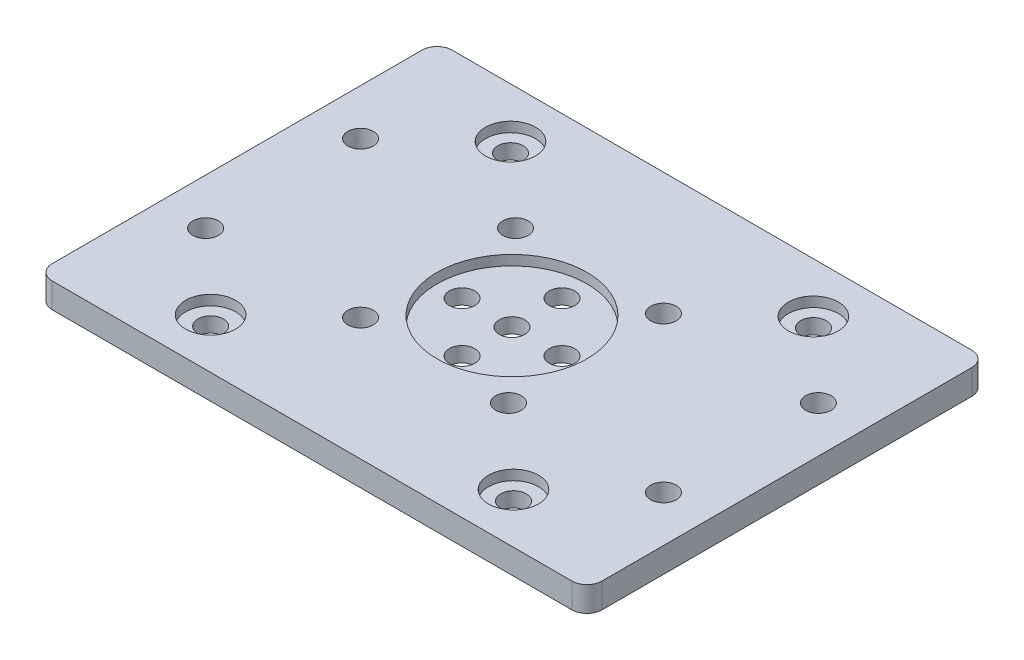
ISO-10303-21;
HEADER;
FILE_DESCRIPTION(('STEP AP214'),'2;1');
FILE_NAME('part.step','',(''),(''),'','','');
FILE_SCHEMA(('AUTOMOTIVE_DESIGN { 1 0 10303 214 1 1 1 1 }'));
ENDSEC;
DATA;
#1=APPLICATION_CONTEXT('core data for automotive mechanical design processes');
#2=APPLICATION_PROTOCOL_DEFINITION('international standard','automotive_design',2000,#1);
#3=PRODUCT_CONTEXT('',#1,'mechanical');
#4=PRODUCT('Part','Part','',(#3));
#5=PRODUCT_RELATED_PRODUCT_CATEGORY('part','',(#4));
#6=PRODUCT_DEFINITION_FORMATION('','',#4);
#7=PRODUCT_DEFINITION_CONTEXT('part definition',#1,'design');
#8=PRODUCT_DEFINITION('design','',#6,#7);
#9=PRODUCT_DEFINITION_SHAPE('','',#8);
#10=(LENGTH_UNIT() NAMED_UNIT(*) SI_UNIT(.MILLI.,.METRE.));
#11=(NAMED_UNIT(*) PLANE_ANGLE_UNIT() SI_UNIT($,.RADIAN.));
#12=(NAMED_UNIT(*) SI_UNIT($,.STERADIAN.) SOLID_ANGLE_UNIT());
#13=UNCERTAINTY_MEASURE_WITH_UNIT(LENGTH_MEASURE(1.E-05),#10,'distance_accuracy_value','');
#14=(GEOMETRIC_REPRESENTATION_CONTEXT(3) GLOBAL_UNCERTAINTY_ASSIGNED_CONTEXT((#13)) GLOBAL_UNIT_ASSIGNED_CONTEXT((#10,
#11,#12)) REPRESENTATION_CONTEXT('',''));
#15=CARTESIAN_POINT('',(0.,0.,0.));
#16=DIRECTION('',(0.,0.,1.));
#17=DIRECTION('',(1.,0.,0.));
#18=AXIS2_PLACEMENT_3D('',#15,#16,#17);
#19=CARTESIAN_POINT('',(0.,5.,0.));
#20=DIRECTION('',(0.,-1.,0.));
#21=DIRECTION('',(0.,0.,-1.));
#22=AXIS2_PLACEMENT_3D('',#19,#20,#21);
#23=CYLINDRICAL_SURFACE('',#22,2.55);
#24=CARTESIAN_POINT('',(0.,0.,0.));
#25=DIRECTION('',(0.,1.,0.));
#26=DIRECTION('',(0.,0.,1.));
#27=AXIS2_PLACEMENT_3D('',#24,#25,#26);
#28=CIRCLE('',#27,2.55);
#29=CARTESIAN_POINT('',(0.,0.,2.55));
#30=VERTEX_POINT('',#29);
#31=EDGE_CURVE('E137',#30,#30,#28,.T.);
#32=ORIENTED_EDGE('',*,*,#31,.F.);
#33=EDGE_LOOP('',(#32));
#34=FACE_BOUND('',#33,.T.);
#35=CARTESIAN_POINT('',(0.,3.,0.));
#36=DIRECTION('',(0.,1.,0.));
#37=DIRECTION('',(0.,0.,1.));
#38=AXIS2_PLACEMENT_3D('',#35,#36,#37);
#39=CIRCLE('',#38,2.55);
#40=CARTESIAN_POINT('',(0.,3.,2.55));
#41=VERTEX_POINT('',#40);
#42=EDGE_CURVE('E188',#41,#41,#39,.T.);
#43=ORIENTED_EDGE('',*,*,#42,.T.);
#44=EDGE_LOOP('',(#43));
#45=FACE_BOUND('',#44,.T.);
#46=ADVANCED_FACE('F33',(#34,#45),#23,.F.);
#47=CARTESIAN_POINT('',(0.,5.,-10.));
#48=DIRECTION('',(0.,-1.,0.));
#49=DIRECTION('',(0.,0.,-1.));
#50=AXIS2_PLACEMENT_3D('',#47,#48,#49);
#51=CYLINDRICAL_SURFACE('',#50,2.55);
#52=CARTESIAN_POINT('',(0.,0.,-10.));
#53=DIRECTION('',(0.,1.,0.));
#54=DIRECTION('',(0.,0.,1.));
#55=AXIS2_PLACEMENT_3D('',#52,#53,#54);
#56=CIRCLE('',#55,2.55);
#57=CARTESIAN_POINT('',(0.,0.,-7.45));
#58=VERTEX_POINT('',#57);
#59=EDGE_CURVE('E271',#58,#58,#56,.T.);
#60=ORIENTED_EDGE('',*,*,#59,.F.);
#61=EDGE_LOOP('',(#60));
#62=FACE_BOUND('',#61,.T.);
#63=CARTESIAN_POINT('',(0.,3.,-10.));
#64=DIRECTION('',(0.,1.,0.));
#65=DIRECTION('',(0.,0.,1.));
#66=AXIS2_PLACEMENT_3D('',#63,#64,#65);
#67=CIRCLE('',#66,2.55);
#68=CARTESIAN_POINT('',(0.,3.,-7.45));
#69=VERTEX_POINT('',#68);
#70=EDGE_CURVE('E353',#69,#69,#67,.T.);
#71=ORIENTED_EDGE('',*,*,#70,.T.);
#72=EDGE_LOOP('',(#71));
#73=FACE_BOUND('',#72,.T.);
#74=ADVANCED_FACE('F313',(#62,#73),#51,.F.);
#75=CARTESIAN_POINT('',(10.,5.,0.));
#76=DIRECTION('',(0.,-1.,0.));
#77=DIRECTION('',(0.,0.,-1.));
#78=AXIS2_PLACEMENT_3D('',#75,#76,#77);
#79=CYLINDRICAL_SURFACE('',#78,2.55);
#80=CARTESIAN_POINT('',(10.,0.,0.));
#81=DIRECTION('',(0.,1.,0.));
#82=DIRECTION('',(0.,0.,1.));
#83=AXIS2_PLACEMENT_3D('',#80,#81,#82);
#84=CIRCLE('',#83,2.55);
#85=CARTESIAN_POINT('',(10.,0.,2.55));
#86=VERTEX_POINT('',#85);
#87=EDGE_CURVE('E268',#86,#86,#84,.T.);
#88=ORIENTED_EDGE('',*,*,#87,.F.);
#89=EDGE_LOOP('',(#88));
#90=FACE_BOUND('',#89,.T.);
#91=CARTESIAN_POINT('',(10.,3.,0.));
#92=DIRECTION('',(0.,1.,0.));
#93=DIRECTION('',(0.,0.,1.));
#94=AXIS2_PLACEMENT_3D('',#91,#92,#93);
#95=CIRCLE('',#94,2.55);
#96=CARTESIAN_POINT('',(10.,3.,2.55));
#97=VERTEX_POINT('',#96);
#98=EDGE_CURVE('E355',#97,#97,#95,.T.);
#99=ORIENTED_EDGE('',*,*,#98,.T.);
#100=EDGE_LOOP('',(#99));
#101=FACE_BOUND('',#100,.T.);
#102=ADVANCED_FACE('F319',(#90,#101),#79,.F.);
#103=CARTESIAN_POINT('',(-9.99999999999999,5.,0.));
#104=DIRECTION('',(0.,-1.,0.));
#105=DIRECTION('',(0.,0.,-1.));
#106=AXIS2_PLACEMENT_3D('',#103,#104,#105);
#107=CYLINDRICAL_SURFACE('',#106,2.55);
#108=CARTESIAN_POINT('',(-9.99999999999999,0.,0.));
#109=DIRECTION('',(0.,1.,0.));
#110=DIRECTION('',(0.,0.,-1.));
#111=AXIS2_PLACEMENT_3D('',#108,#109,#110);
#112=CIRCLE('',#111,2.55);
#113=CARTESIAN_POINT('',(-9.99999999999999,0.,-2.55));
#114=VERTEX_POINT('',#113);
#115=EDGE_CURVE('E263',#114,#114,#112,.T.);
#116=ORIENTED_EDGE('',*,*,#115,.F.);
#117=EDGE_LOOP('',(#116));
#118=FACE_BOUND('',#117,.T.);
#119=CARTESIAN_POINT('',(-9.99999999999999,3.,0.));
#120=DIRECTION('',(0.,1.,0.));
#121=DIRECTION('',(0.,0.,1.));
#122=AXIS2_PLACEMENT_3D('',#119,#120,#121);
#123=CIRCLE('',#122,2.55);
#124=CARTESIAN_POINT('',(-9.99999999999999,3.,2.55));
#125=VERTEX_POINT('',#124);
#126=EDGE_CURVE('E358',#125,#125,#123,.T.);
#127=ORIENTED_EDGE('',*,*,#126,.T.);
#128=EDGE_LOOP('',(#127));
#129=FACE_BOUND('',#128,.T.);
#130=ADVANCED_FACE('F454',(#118,#129),#107,.F.);
#131=CARTESIAN_POINT('',(0.,5.,10.));
#132=DIRECTION('',(0.,-1.,0.));
#133=DIRECTION('',(0.,0.,-1.));
#134=AXIS2_PLACEMENT_3D('',#131,#132,#133);
#135=CYLINDRICAL_SURFACE('',#134,2.55);
#136=CARTESIAN_POINT('',(0.,0.,10.));
#137=DIRECTION('',(0.,1.,0.));
#138=DIRECTION('',(0.,0.,-1.));
#139=AXIS2_PLACEMENT_3D('',#136,#137,#138);
#140=CIRCLE('',#139,2.55);
#141=CARTESIAN_POINT('',(0.,0.,7.45));
#142=VERTEX_POINT('',#141);
#143=EDGE_CURVE('E242',#142,#142,#140,.T.);
#144=ORIENTED_EDGE('',*,*,#143,.F.);
#145=EDGE_LOOP('',(#144));
#146=FACE_BOUND('',#145,.T.);
#147=CARTESIAN_POINT('',(0.,3.,10.));
#148=DIRECTION('',(0.,1.,0.));
#149=DIRECTION('',(0.,0.,1.));
#150=AXIS2_PLACEMENT_3D('',#147,#148,#149);
#151=CIRCLE('',#150,2.55);
#152=CARTESIAN_POINT('',(0.,3.,12.55));
#153=VERTEX_POINT('',#152);
#154=EDGE_CURVE('E37',#153,#153,#151,.T.);
#155=ORIENTED_EDGE('',*,*,#154,.T.);
#156=EDGE_LOOP('',(#155));
#157=FACE_BOUND('',#156,.T.);
#158=ADVANCED_FACE('F373',(#146,#157),#135,.F.);
#159=CARTESIAN_POINT('',(30.3,5.,-30.));
#160=DIRECTION('',(0.,-1.,0.));
#161=DIRECTION('',(0.,0.,-1.));
#162=AXIS2_PLACEMENT_3D('',#159,#160,#161);
#163=CYLINDRICAL_SURFACE('',#162,2.54999999999999);
#164=CARTESIAN_POINT('',(30.3,0.,-30.));
#165=DIRECTION('',(0.,1.,0.));
#166=DIRECTION('',(0.,0.,1.));
#167=AXIS2_PLACEMENT_3D('',#164,#165,#166);
#168=CIRCLE('',#167,2.54999999999999);
#169=CARTESIAN_POINT('',(30.3,0.,-27.45));
#170=VERTEX_POINT('',#169);
#171=EDGE_CURVE('E247',#170,#170,#168,.T.);
#172=ORIENTED_EDGE('',*,*,#171,.F.);
#173=EDGE_LOOP('',(#172));
#174=FACE_BOUND('',#173,.T.);
#175=CARTESIAN_POINT('',(30.3,3.,-30.));
#176=DIRECTION('',(0.,1.,0.));
#177=DIRECTION('',(0.,0.,1.));
#178=AXIS2_PLACEMENT_3D('',#175,#176,#177);
#179=CIRCLE('',#178,2.54999999999999);
#180=CARTESIAN_POINT('',(30.3,3.,-27.45));
#181=VERTEX_POINT('',#180);
#182=EDGE_CURVE('E174',#181,#181,#179,.T.);
#183=ORIENTED_EDGE('',*,*,#182,.T.);
#184=EDGE_LOOP('',(#183));
#185=FACE_BOUND('',#184,.T.);
#186=ADVANCED_FACE('F443',(#174,#185),#163,.F.);
#187=CARTESIAN_POINT('',(30.3,5.,30.));
#188=DIRECTION('',(0.,-1.,0.));
#189=DIRECTION('',(0.,0.,-1.));
#190=AXIS2_PLACEMENT_3D('',#187,#188,#189);
#191=CYLINDRICAL_SURFACE('',#190,2.55);
#192=CARTESIAN_POINT('',(30.3,0.,30.));
#193=DIRECTION('',(0.,1.,0.));
#194=DIRECTION('',(0.,0.,-1.));
#195=AXIS2_PLACEMENT_3D('',#192,#193,#194);
#196=CIRCLE('',#195,2.55);
#197=CARTESIAN_POINT('',(30.3,0.,27.45));
#198=VERTEX_POINT('',#197);
#199=EDGE_CURVE('E227',#198,#198,#196,.T.);
#200=ORIENTED_EDGE('',*,*,#199,.F.);
#201=EDGE_LOOP('',(#200));
#202=FACE_BOUND('',#201,.T.);
#203=CARTESIAN_POINT('',(30.3,3.,30.));
#204=DIRECTION('',(0.,1.,0.));
#205=DIRECTION('',(0.,0.,1.));
#206=AXIS2_PLACEMENT_3D('',#203,#204,#205);
#207=CIRCLE('',#206,2.55);
#208=CARTESIAN_POINT('',(30.3,3.,32.55));
#209=VERTEX_POINT('',#208);
#210=EDGE_CURVE('E170',#209,#209,#207,.T.);
#211=ORIENTED_EDGE('',*,*,#210,.T.);
#212=EDGE_LOOP('',(#211));
#213=FACE_BOUND('',#212,.T.);
#214=ADVANCED_FACE('F440',(#202,#213),#191,.F.);
#215=CARTESIAN_POINT('',(-30.3,5.,-30.));
#216=DIRECTION('',(0.,-1.,0.));
#217=DIRECTION('',(0.,0.,-1.));
#218=AXIS2_PLACEMENT_3D('',#215,#216,#217);
#219=CYLINDRICAL_SURFACE('',#218,2.55);
#220=CARTESIAN_POINT('',(-30.3,0.,-30.));
#221=DIRECTION('',(0.,1.,0.));
#222=DIRECTION('',(0.,0.,1.));
#223=AXIS2_PLACEMENT_3D('',#220,#221,#222);
#224=CIRCLE('',#223,2.55);
#225=CARTESIAN_POINT('',(-30.3,0.,-27.45));
#226=VERTEX_POINT('',#225);
#227=EDGE_CURVE('E254',#226,#226,#224,.T.);
#228=ORIENTED_EDGE('',*,*,#227,.F.);
#229=EDGE_LOOP('',(#228));
#230=FACE_BOUND('',#229,.T.);
#231=CARTESIAN_POINT('',(-30.3,3.,-30.));
#232=DIRECTION('',(0.,1.,0.));
#233=DIRECTION('',(0.,0.,1.));
#234=AXIS2_PLACEMENT_3D('',#231,#232,#233);
#235=CIRCLE('',#234,2.55);
#236=CARTESIAN_POINT('',(-30.3,3.,-27.45));
#237=VERTEX_POINT('',#236);
#238=EDGE_CURVE('E165',#237,#237,#235,.T.);
#239=ORIENTED_EDGE('',*,*,#238,.T.);
#240=EDGE_LOOP('',(#239));
#241=FACE_BOUND('',#240,.T.);
#242=ADVANCED_FACE('F422',(#230,#241),#219,.F.);
#243=CARTESIAN_POINT('',(-30.3,5.,30.));
#244=DIRECTION('',(0.,-1.,0.));
#245=DIRECTION('',(0.,0.,-1.));
#246=AXIS2_PLACEMENT_3D('',#243,#244,#245);
#247=CYLINDRICAL_SURFACE('',#246,2.55);
#248=CARTESIAN_POINT('',(-30.3,0.,30.));
#249=DIRECTION('',(0.,1.,0.));
#250=DIRECTION('',(0.,0.,-1.));
#251=AXIS2_PLACEMENT_3D('',#248,#249,#250);
#252=CIRCLE('',#251,2.55);
#253=CARTESIAN_POINT('',(-30.3,0.,27.45));
#254=VERTEX_POINT('',#253);
#255=EDGE_CURVE('E163',#254,#254,#252,.T.);
#256=ORIENTED_EDGE('',*,*,#255,.F.);
#257=EDGE_LOOP('',(#256));
#258=FACE_BOUND('',#257,.T.);
#259=CARTESIAN_POINT('',(-30.3,3.,30.));
#260=DIRECTION('',(0.,1.,0.));
#261=DIRECTION('',(0.,0.,1.));
#262=AXIS2_PLACEMENT_3D('',#259,#260,#261);
#263=CIRCLE('',#262,2.55);
#264=CARTESIAN_POINT('',(-30.3,3.,32.55));
#265=VERTEX_POINT('',#264);
#266=EDGE_CURVE('E160',#265,#265,#263,.T.);
#267=ORIENTED_EDGE('',*,*,#266,.T.);
#268=EDGE_LOOP('',(#267));
#269=FACE_BOUND('',#268,.T.);
#270=ADVANCED_FACE('F327',(#258,#269),#247,.F.);
#271=CARTESIAN_POINT('',(-52.,5.,37.));
#272=DIRECTION('',(0.,-1.,0.));
#273=DIRECTION('',(0.,0.,-1.));
#274=AXIS2_PLACEMENT_3D('',#271,#272,#273);
#275=PLANE('',#274);
#276=CARTESIAN_POINT('',(0.,5.,0.));
#277=DIRECTION('',(0.,1.,0.));
#278=DIRECTION('',(0.,0.,1.));
#279=AXIS2_PLACEMENT_3D('',#276,#277,#278);
#280=CIRCLE('',#279,15.);
#281=CARTESIAN_POINT('',(0.,5.,15.));
#282=VERTEX_POINT('',#281);
#283=EDGE_CURVE('E363',#282,#282,#280,.T.);
#284=ORIENTED_EDGE('',*,*,#283,.F.);
#285=EDGE_LOOP('',(#284));
#286=FACE_BOUND('',#285,.T.);
#287=CARTESIAN_POINT('',(30.3,5.,-30.));
#288=DIRECTION('',(0.,1.,0.));
#289=DIRECTION('',(0.,0.,1.));
#290=AXIS2_PLACEMENT_3D('',#287,#288,#289);
#291=CIRCLE('',#290,4.99999999999999);
#292=CARTESIAN_POINT('',(30.3,5.,-25.));
#293=VERTEX_POINT('',#292);
#294=EDGE_CURVE('E183',#293,#293,#291,.T.);
#295=ORIENTED_EDGE('',*,*,#294,.F.);
#296=EDGE_LOOP('',(#295));
#297=FACE_BOUND('',#296,.T.);
#298=CARTESIAN_POINT('',(30.3,5.,30.));
#299=DIRECTION('',(0.,1.,0.));
#300=DIRECTION('',(0.,0.,1.));
#301=AXIS2_PLACEMENT_3D('',#298,#299,#300);
#302=CIRCLE('',#301,5.);
#303=CARTESIAN_POINT('',(30.3,5.,35.));
#304=VERTEX_POINT('',#303);
#305=EDGE_CURVE('E176',#304,#304,#302,.T.);
#306=ORIENTED_EDGE('',*,*,#305,.F.);
#307=EDGE_LOOP('',(#306));
#308=FACE_BOUND('',#307,.T.);
#309=CARTESIAN_POINT('',(-30.3,5.,-30.));
#310=DIRECTION('',(0.,1.,0.));
#311=DIRECTION('',(0.,0.,1.));
#312=AXIS2_PLACEMENT_3D('',#309,#310,#311);
#313=CIRCLE('',#312,5.);
#314=CARTESIAN_POINT('',(-30.3,5.,-25.));
#315=VERTEX_POINT('',#314);
#316=EDGE_CURVE('E172',#315,#315,#313,.T.);
#317=ORIENTED_EDGE('',*,*,#316,.F.);
#318=EDGE_LOOP('',(#317));
#319=FACE_BOUND('',#318,.T.);
#320=CARTESIAN_POINT('',(-30.3,5.,30.));
#321=DIRECTION('',(0.,1.,0.));
#322=DIRECTION('',(0.,0.,1.));
#323=AXIS2_PLACEMENT_3D('',#320,#321,#322);
#324=CIRCLE('',#323,5.);
#325=CARTESIAN_POINT('',(-30.3,5.,35.));
#326=VERTEX_POINT('',#325);
#327=EDGE_CURVE('E168',#326,#326,#324,.T.);
#328=ORIENTED_EDGE('',*,*,#327,.F.);
#329=EDGE_LOOP('',(#328));
#330=FACE_BOUND('',#329,.T.);
#331=CARTESIAN_POINT('',(-45.8,5.,15.5));
#332=DIRECTION('',(0.,1.,0.));
#333=DIRECTION('',(0.,0.,-1.));
#334=AXIS2_PLACEMENT_3D('',#331,#332,#333);
#335=CIRCLE('',#334,2.55);
#336=CARTESIAN_POINT('',(-45.8,5.,12.95));
#337=VERTEX_POINT('',#336);
#338=EDGE_CURVE('E206',#337,#337,#335,.T.);
#339=ORIENTED_EDGE('',*,*,#338,.F.);
#340=EDGE_LOOP('',(#339));
#341=FACE_BOUND('',#340,.T.);
#342=CARTESIAN_POINT('',(14.8,5.,15.5));
#343=DIRECTION('',(0.,1.,0.));
#344=DIRECTION('',(0.,0.,1.));
#345=AXIS2_PLACEMENT_3D('',#342,#343,#344);
#346=CIRCLE('',#345,2.55);
#347=CARTESIAN_POINT('',(14.8,5.,18.05));
#348=VERTEX_POINT('',#347);
#349=EDGE_CURVE('E218',#348,#348,#346,.T.);
#350=ORIENTED_EDGE('',*,*,#349,.F.);
#351=EDGE_LOOP('',(#350));
#352=FACE_BOUND('',#351,.T.);
#353=CARTESIAN_POINT('',(14.8,5.,-15.5));
#354=DIRECTION('',(0.,1.,0.));
#355=DIRECTION('',(0.,0.,-1.));
#356=AXIS2_PLACEMENT_3D('',#353,#354,#355);
#357=CIRCLE('',#356,2.55);
#358=CARTESIAN_POINT('',(14.8,5.,-18.05));
#359=VERTEX_POINT('',#358);
#360=EDGE_CURVE('E239',#359,#359,#357,.T.);
#361=ORIENTED_EDGE('',*,*,#360,.F.);
#362=EDGE_LOOP('',(#361));
#363=FACE_BOUND('',#362,.T.);
#364=CARTESIAN_POINT('',(-52.,5.,37.));
#365=DIRECTION('',(0.,1.,0.));
#366=DIRECTION('',(0.,0.,-1.));
#367=AXIS2_PLACEMENT_3D('',#364,#365,#366);
#368=CIRCLE('',#367,3.00000000000001);
#369=CARTESIAN_POINT('',(-55.,5.,37.));
#370=VERTEX_POINT('',#369);
#371=CARTESIAN_POINT('',(-52.,5.,40.));
#372=VERTEX_POINT('',#371);
#373=EDGE_CURVE('E148',#370,#372,#368,.T.);
#374=ORIENTED_EDGE('',*,*,#373,.T.);
#375=DIRECTION('',(1.,0.,0.));
#376=VECTOR('',#375,1.);
#377=CARTESIAN_POINT('',(52.,5.,40.));
#378=LINE('',#377,#376);
#379=CARTESIAN_POINT('',(52.,5.,40.));
#380=VERTEX_POINT('',#379);
#381=EDGE_CURVE('E95',#372,#380,#378,.T.);
#382=ORIENTED_EDGE('',*,*,#381,.T.);
#383=CARTESIAN_POINT('',(52.,5.,37.));
#384=DIRECTION('',(0.,1.,0.));
#385=DIRECTION('',(0.,0.,1.));
#386=AXIS2_PLACEMENT_3D('',#383,#384,#385);
#387=CIRCLE('',#386,3.00000000000002);
#388=CARTESIAN_POINT('',(55.,5.,37.));
#389=VERTEX_POINT('',#388);
#390=EDGE_CURVE('E278',#380,#389,#387,.T.);
#391=ORIENTED_EDGE('',*,*,#390,.T.);
#392=DIRECTION('',(0.,0.,-1.));
#393=VECTOR('',#392,1.);
#394=CARTESIAN_POINT('',(55.,5.,37.));
#395=LINE('',#394,#393);
#396=CARTESIAN_POINT('',(55.,5.,-37.));
#397=VERTEX_POINT('',#396);
#398=EDGE_CURVE('E280',#389,#397,#395,.T.);
#399=ORIENTED_EDGE('',*,*,#398,.T.);
#400=CARTESIAN_POINT('',(52.,5.,-37.));
#401=DIRECTION('',(0.,1.,0.));
#402=DIRECTION('',(0.,0.,1.));
#403=AXIS2_PLACEMENT_3D('',#400,#401,#402);
#404=CIRCLE('',#403,3.00000000000002);
#405=CARTESIAN_POINT('',(52.,5.,-40.));
#406=VERTEX_POINT('',#405);
#407=EDGE_CURVE('E115',#397,#406,#404,.T.);
#408=ORIENTED_EDGE('',*,*,#407,.T.);
#409=DIRECTION('',(-1.,0.,0.));
#410=VECTOR('',#409,1.);
#411=CARTESIAN_POINT('',(52.,5.,-40.));
#412=LINE('',#411,#410);
#413=CARTESIAN_POINT('',(-52.,5.,-40.));
#414=VERTEX_POINT('',#413);
#415=EDGE_CURVE('E108',#406,#414,#412,.T.);
#416=ORIENTED_EDGE('',*,*,#415,.T.);
#417=CARTESIAN_POINT('',(-52.,5.,-37.));
#418=DIRECTION('',(0.,1.,0.));
#419=DIRECTION('',(0.,0.,1.));
#420=AXIS2_PLACEMENT_3D('',#417,#418,#419);
#421=CIRCLE('',#420,3.00000000000002);
#422=CARTESIAN_POINT('',(-55.,5.,-37.));
#423=VERTEX_POINT('',#422);
#424=EDGE_CURVE('E113',#414,#423,#421,.T.);
#425=ORIENTED_EDGE('',*,*,#424,.T.);
#426=DIRECTION('',(0.,0.,1.));
#427=VECTOR('',#426,1.);
#428=CARTESIAN_POINT('',(-55.,5.,37.));
#429=LINE('',#428,#427);
#430=EDGE_CURVE('E52',#423,#370,#429,.T.);
#431=ORIENTED_EDGE('',*,*,#430,.T.);
#432=EDGE_LOOP('',(#374,#382,#391,#399,#408,#416,#425,#431));
#433=FACE_BOUND('',#432,.T.);
#434=CARTESIAN_POINT('',(-45.8,5.,-15.5));
#435=DIRECTION('',(0.,1.,0.));
#436=DIRECTION('',(0.,0.,1.));
#437=AXIS2_PLACEMENT_3D('',#434,#435,#436);
#438=CIRCLE('',#437,2.55);
#439=CARTESIAN_POINT('',(-45.8,5.,-12.95));
#440=VERTEX_POINT('',#439);
#441=EDGE_CURVE('E260',#440,#440,#438,.T.);
#442=ORIENTED_EDGE('',*,*,#441,.F.);
#443=EDGE_LOOP('',(#442));
#444=FACE_BOUND('',#443,.T.);
#445=CARTESIAN_POINT('',(-14.8,5.,-15.5));
#446=DIRECTION('',(0.,1.,0.));
#447=DIRECTION('',(0.,0.,1.));
#448=AXIS2_PLACEMENT_3D('',#445,#446,#447);
#449=CIRCLE('',#448,2.55);
#450=CARTESIAN_POINT('',(-14.8,5.,-12.95));
#451=VERTEX_POINT('',#450);
#452=EDGE_CURVE('E251',#451,#451,#449,.T.);
#453=ORIENTED_EDGE('',*,*,#452,.F.);
#454=EDGE_LOOP('',(#453));
#455=FACE_BOUND('',#454,.T.);
#456=CARTESIAN_POINT('',(45.8,5.,-15.5));
#457=DIRECTION('',(0.,1.,0.));
#458=DIRECTION('',(0.,0.,-1.));
#459=AXIS2_PLACEMENT_3D('',#456,#457,#458);
#460=CIRCLE('',#459,2.55000000000001);
#461=CARTESIAN_POINT('',(45.8,5.,-18.05));
#462=VERTEX_POINT('',#461);
#463=EDGE_CURVE('E233',#462,#462,#460,.T.);
#464=ORIENTED_EDGE('',*,*,#463,.F.);
#465=EDGE_LOOP('',(#464));
#466=FACE_BOUND('',#465,.T.);
#467=CARTESIAN_POINT('',(45.8,5.,15.5));
#468=DIRECTION('',(0.,1.,0.));
#469=DIRECTION('',(0.,0.,1.));
#470=AXIS2_PLACEMENT_3D('',#467,#468,#469);
#471=CIRCLE('',#470,2.55000000000001);
#472=CARTESIAN_POINT('',(45.8,5.,18.05));
#473=VERTEX_POINT('',#472);
#474=EDGE_CURVE('E224',#473,#473,#471,.T.);
#475=ORIENTED_EDGE('',*,*,#474,.F.);
#476=EDGE_LOOP('',(#475));
#477=FACE_BOUND('',#476,.T.);
#478=CARTESIAN_POINT('',(-14.8,5.,15.5));
#479=DIRECTION('',(0.,1.,0.));
#480=DIRECTION('',(0.,0.,-1.));
#481=AXIS2_PLACEMENT_3D('',#478,#479,#480);
#482=CIRCLE('',#481,2.55);
#483=CARTESIAN_POINT('',(-14.8,5.,12.95));
#484=VERTEX_POINT('',#483);
#485=EDGE_CURVE('E212',#484,#484,#482,.T.);
#486=ORIENTED_EDGE('',*,*,#485,.F.);
#487=EDGE_LOOP('',(#486));
#488=FACE_BOUND('',#487,.T.);
#489=ADVANCED_FACE('F110',(#286,#297,#308,#319,#330,#341,#352,#363,#433,#444,#455,#466,#477,
#488),#275,.F.);
#490=CARTESIAN_POINT('',(-52.,0.,37.));
#491=DIRECTION('',(0.,-1.,0.));
#492=DIRECTION('',(0.,0.,-1.));
#493=AXIS2_PLACEMENT_3D('',#490,#491,#492);
#494=PLANE('',#493);
#495=CARTESIAN_POINT('',(-45.8,0.,15.5));
#496=DIRECTION('',(0.,1.,0.));
#497=DIRECTION('',(0.,0.,-1.));
#498=AXIS2_PLACEMENT_3D('',#495,#496,#497);
#499=CIRCLE('',#498,2.55);
#500=CARTESIAN_POINT('',(-45.8,0.,12.95));
#501=VERTEX_POINT('',#500);
#502=EDGE_CURVE('E205',#501,#501,#499,.T.);
#503=ORIENTED_EDGE('',*,*,#502,.T.);
#504=EDGE_LOOP('',(#503));
#505=FACE_BOUND('',#504,.T.);
#506=CARTESIAN_POINT('',(14.8,0.,15.5));
#507=DIRECTION('',(0.,1.,0.));
#508=DIRECTION('',(0.,0.,1.));
#509=AXIS2_PLACEMENT_3D('',#506,#507,#508);
#510=CIRCLE('',#509,2.55);
#511=CARTESIAN_POINT('',(14.8,0.,18.05));
#512=VERTEX_POINT('',#511);
#513=EDGE_CURVE('E215',#512,#512,#510,.T.);
#514=ORIENTED_EDGE('',*,*,#513,.T.);
#515=EDGE_LOOP('',(#514));
#516=FACE_BOUND('',#515,.T.);
#517=ORIENTED_EDGE('',*,*,#199,.T.);
#518=EDGE_LOOP('',(#517));
#519=FACE_BOUND('',#518,.T.);
#520=CARTESIAN_POINT('',(14.8,0.,-15.5));
#521=DIRECTION('',(0.,1.,0.));
#522=DIRECTION('',(0.,0.,-1.));
#523=AXIS2_PLACEMENT_3D('',#520,#521,#522);
#524=CIRCLE('',#523,2.55);
#525=CARTESIAN_POINT('',(14.8,0.,-18.05));
#526=VERTEX_POINT('',#525);
#527=EDGE_CURVE('E236',#526,#526,#524,.T.);
#528=ORIENTED_EDGE('',*,*,#527,.T.);
#529=EDGE_LOOP('',(#528));
#530=FACE_BOUND('',#529,.T.);
#531=ORIENTED_EDGE('',*,*,#171,.T.);
#532=EDGE_LOOP('',(#531));
#533=FACE_BOUND('',#532,.T.);
#534=ORIENTED_EDGE('',*,*,#227,.T.);
#535=EDGE_LOOP('',(#534));
#536=FACE_BOUND('',#535,.T.);
#537=ORIENTED_EDGE('',*,*,#115,.T.);
#538=EDGE_LOOP('',(#537));
#539=FACE_BOUND('',#538,.T.);
#540=ORIENTED_EDGE('',*,*,#59,.T.);
#541=EDGE_LOOP('',(#540));
#542=FACE_BOUND('',#541,.T.);
#543=CARTESIAN_POINT('',(-52.,0.,37.));
#544=DIRECTION('',(0.,1.,0.));
#545=DIRECTION('',(0.,0.,-1.));
#546=AXIS2_PLACEMENT_3D('',#543,#544,#545);
#547=CIRCLE('',#546,3.00000000000001);
#548=CARTESIAN_POINT('',(-55.,0.,37.));
#549=VERTEX_POINT('',#548);
#550=CARTESIAN_POINT('',(-52.,0.,40.));
#551=VERTEX_POINT('',#550);
#552=EDGE_CURVE('E133',#549,#551,#547,.T.);
#553=ORIENTED_EDGE('',*,*,#552,.F.);
#554=DIRECTION('',(0.,0.,1.));
#555=VECTOR('',#554,1.);
#556=CARTESIAN_POINT('',(-55.,0.,37.));
#557=LINE('',#556,#555);
#558=CARTESIAN_POINT('',(-55.,0.,-37.));
#559=VERTEX_POINT('',#558);
#560=EDGE_CURVE('E87',#559,#549,#557,.T.);
#561=ORIENTED_EDGE('',*,*,#560,.F.);
#562=CARTESIAN_POINT('',(-52.,0.,-37.));
#563=DIRECTION('',(0.,1.,0.));
#564=DIRECTION('',(0.,0.,1.));
#565=AXIS2_PLACEMENT_3D('',#562,#563,#564);
#566=CIRCLE('',#565,3.00000000000002);
#567=CARTESIAN_POINT('',(-52.,0.,-40.));
#568=VERTEX_POINT('',#567);
#569=EDGE_CURVE('E81',#568,#559,#566,.T.);
#570=ORIENTED_EDGE('',*,*,#569,.F.);
#571=DIRECTION('',(-1.,0.,0.));
#572=VECTOR('',#571,1.);
#573=CARTESIAN_POINT('',(52.,0.,-40.));
#574=LINE('',#573,#572);
#575=CARTESIAN_POINT('',(52.,0.,-40.));
#576=VERTEX_POINT('',#575);
#577=EDGE_CURVE('E123',#576,#568,#574,.T.);
#578=ORIENTED_EDGE('',*,*,#577,.F.);
#579=CARTESIAN_POINT('',(52.,0.,-37.));
#580=DIRECTION('',(0.,1.,0.));
#581=DIRECTION('',(0.,0.,1.));
#582=AXIS2_PLACEMENT_3D('',#579,#580,#581);
#583=CIRCLE('',#582,3.00000000000002);
#584=CARTESIAN_POINT('',(55.,0.,-37.));
#585=VERTEX_POINT('',#584);
#586=EDGE_CURVE('E143',#585,#576,#583,.T.);
#587=ORIENTED_EDGE('',*,*,#586,.F.);
#588=DIRECTION('',(0.,0.,-1.));
#589=VECTOR('',#588,1.);
#590=CARTESIAN_POINT('',(55.,0.,37.));
#591=LINE('',#590,#589);
#592=CARTESIAN_POINT('',(55.,0.,37.));
#593=VERTEX_POINT('',#592);
#594=EDGE_CURVE('E141',#593,#585,#591,.T.);
#595=ORIENTED_EDGE('',*,*,#594,.F.);
#596=CARTESIAN_POINT('',(52.,0.,37.));
#597=DIRECTION('',(0.,1.,0.));
#598=DIRECTION('',(0.,0.,1.));
#599=AXIS2_PLACEMENT_3D('',#596,#597,#598);
#600=CIRCLE('',#599,3.00000000000002);
#601=CARTESIAN_POINT('',(52.,0.,40.));
#602=VERTEX_POINT('',#601);
#603=EDGE_CURVE('E139',#602,#593,#600,.T.);
#604=ORIENTED_EDGE('',*,*,#603,.F.);
#605=DIRECTION('',(1.,0.,0.));
#606=VECTOR('',#605,1.);
#607=CARTESIAN_POINT('',(52.,0.,40.));
#608=LINE('',#607,#606);
#609=EDGE_CURVE('E136',#551,#602,#608,.T.);
#610=ORIENTED_EDGE('',*,*,#609,.F.);
#611=EDGE_LOOP('',(#553,#561,#570,#578,#587,#595,#604,#610));
#612=FACE_BOUND('',#611,.T.);
#613=ORIENTED_EDGE('',*,*,#31,.T.);
#614=EDGE_LOOP('',(#613));
#615=FACE_BOUND('',#614,.T.);
#616=ORIENTED_EDGE('',*,*,#87,.T.);
#617=EDGE_LOOP('',(#616));
#618=FACE_BOUND('',#617,.T.);
#619=CARTESIAN_POINT('',(-45.8,0.,-15.5));
#620=DIRECTION('',(0.,1.,0.));
#621=DIRECTION('',(0.,0.,1.));
#622=AXIS2_PLACEMENT_3D('',#619,#620,#621);
#623=CIRCLE('',#622,2.55);
#624=CARTESIAN_POINT('',(-45.8,0.,-12.95));
#625=VERTEX_POINT('',#624);
#626=EDGE_CURVE('E259',#625,#625,#623,.T.);
#627=ORIENTED_EDGE('',*,*,#626,.T.);
#628=EDGE_LOOP('',(#627));
#629=FACE_BOUND('',#628,.T.);
#630=CARTESIAN_POINT('',(-14.8,0.,-15.5));
#631=DIRECTION('',(0.,1.,0.));
#632=DIRECTION('',(0.,0.,1.));
#633=AXIS2_PLACEMENT_3D('',#630,#631,#632);
#634=CIRCLE('',#633,2.55);
#635=CARTESIAN_POINT('',(-14.8,0.,-12.95));
#636=VERTEX_POINT('',#635);
#637=EDGE_CURVE('E250',#636,#636,#634,.T.);
#638=ORIENTED_EDGE('',*,*,#637,.T.);
#639=EDGE_LOOP('',(#638));
#640=FACE_BOUND('',#639,.T.);
#641=ORIENTED_EDGE('',*,*,#143,.T.);
#642=EDGE_LOOP('',(#641));
#643=FACE_BOUND('',#642,.T.);
#644=CARTESIAN_POINT('',(45.8,0.,-15.5));
#645=DIRECTION('',(0.,1.,0.));
#646=DIRECTION('',(0.,0.,-1.));
#647=AXIS2_PLACEMENT_3D('',#644,#645,#646);
#648=CIRCLE('',#647,2.55000000000001);
#649=CARTESIAN_POINT('',(45.8,0.,-18.05));
#650=VERTEX_POINT('',#649);
#651=EDGE_CURVE('E232',#650,#650,#648,.T.);
#652=ORIENTED_EDGE('',*,*,#651,.T.);
#653=EDGE_LOOP('',(#652));
#654=FACE_BOUND('',#653,.T.);
#655=CARTESIAN_POINT('',(45.8,0.,15.5));
#656=DIRECTION('',(0.,1.,0.));
#657=DIRECTION('',(0.,0.,1.));
#658=AXIS2_PLACEMENT_3D('',#655,#656,#657);
#659=CIRCLE('',#658,2.55000000000001);
#660=CARTESIAN_POINT('',(45.8,0.,18.05));
#661=VERTEX_POINT('',#660);
#662=EDGE_CURVE('E221',#661,#661,#659,.T.);
#663=ORIENTED_EDGE('',*,*,#662,.T.);
#664=EDGE_LOOP('',(#663));
#665=FACE_BOUND('',#664,.T.);
#666=CARTESIAN_POINT('',(-14.8,0.,15.5));
#667=DIRECTION('',(0.,1.,0.));
#668=DIRECTION('',(0.,0.,-1.));
#669=AXIS2_PLACEMENT_3D('',#666,#667,#668);
#670=CIRCLE('',#669,2.55);
#671=CARTESIAN_POINT('',(-14.8,0.,12.95));
#672=VERTEX_POINT('',#671);
#673=EDGE_CURVE('E209',#672,#672,#670,.T.);
#674=ORIENTED_EDGE('',*,*,#673,.T.);
#675=EDGE_LOOP('',(#674));
#676=FACE_BOUND('',#675,.T.);
#677=ORIENTED_EDGE('',*,*,#255,.T.);
#678=EDGE_LOOP('',(#677));
#679=FACE_BOUND('',#678,.T.);
#680=ADVANCED_FACE('F293',(#505,#516,#519,#530,#533,#536,#539,#542,#612,#615,#618,#629,#640,
#643,#654,#665,#676,#679),#494,.T.);
#681=CARTESIAN_POINT('',(-52.,5.,37.));
#682=DIRECTION('',(0.,-1.,0.));
#683=DIRECTION('',(0.,0.,-1.));
#684=AXIS2_PLACEMENT_3D('',#681,#682,#683);
#685=CYLINDRICAL_SURFACE('',#684,3.00000000000001);
#686=ORIENTED_EDGE('',*,*,#552,.T.);
#687=DIRECTION('',(0.,-1.,0.));
#688=VECTOR('',#687,1.);
#689=CARTESIAN_POINT('',(-52.,5.,40.));
#690=LINE('',#689,#688);
#691=EDGE_CURVE('E11',#372,#551,#690,.T.);
#692=ORIENTED_EDGE('',*,*,#691,.F.);
#693=ORIENTED_EDGE('',*,*,#373,.F.);
#694=DIRECTION('',(0.,-1.,0.));
#695=VECTOR('',#694,1.);
#696=CARTESIAN_POINT('',(-55.,5.,37.));
#697=LINE('',#696,#695);
#698=EDGE_CURVE('E129',#370,#549,#697,.T.);
#699=ORIENTED_EDGE('',*,*,#698,.T.);
#700=EDGE_LOOP('',(#686,#692,#693,#699));
#701=FACE_BOUND('',#700,.T.);
#702=ADVANCED_FACE('F35',(#701),#685,.T.);
#703=CARTESIAN_POINT('',(52.,5.,40.));
#704=DIRECTION('',(0.,0.,-1.));
#705=DIRECTION('',(-1.,0.,0.));
#706=AXIS2_PLACEMENT_3D('',#703,#704,#705);
#707=PLANE('',#706);
#708=ORIENTED_EDGE('',*,*,#609,.T.);
#709=DIRECTION('',(0.,-1.,0.));
#710=VECTOR('',#709,1.);
#711=CARTESIAN_POINT('',(52.,5.,40.));
#712=LINE('',#711,#710);
#713=EDGE_CURVE('E43',#380,#602,#712,.T.);
#714=ORIENTED_EDGE('',*,*,#713,.F.);
#715=ORIENTED_EDGE('',*,*,#381,.F.);
#716=ORIENTED_EDGE('',*,*,#691,.T.);
#717=EDGE_LOOP('',(#708,#714,#715,#716));
#718=FACE_BOUND('',#717,.T.);
#719=ADVANCED_FACE('F334',(#718),#707,.F.);
#720=CARTESIAN_POINT('',(52.,5.,37.));
#721=DIRECTION('',(0.,-1.,0.));
#722=DIRECTION('',(0.,0.,-1.));
#723=AXIS2_PLACEMENT_3D('',#720,#721,#722);
#724=CYLINDRICAL_SURFACE('',#723,3.00000000000002);
#725=ORIENTED_EDGE('',*,*,#603,.T.);
#726=DIRECTION('',(0.,-1.,0.));
#727=VECTOR('',#726,1.);
#728=CARTESIAN_POINT('',(55.,5.,37.));
#729=LINE('',#728,#727);
#730=EDGE_CURVE('E155',#389,#593,#729,.T.);
#731=ORIENTED_EDGE('',*,*,#730,.F.);
#732=ORIENTED_EDGE('',*,*,#390,.F.);
#733=ORIENTED_EDGE('',*,*,#713,.T.);
#734=EDGE_LOOP('',(#725,#731,#732,#733));
#735=FACE_BOUND('',#734,.T.);
#736=ADVANCED_FACE('F673',(#735),#724,.T.);
#737=CARTESIAN_POINT('',(55.,5.,37.));
#738=DIRECTION('',(-1.,0.,0.));
#739=DIRECTION('',(0.,0.,1.));
#740=AXIS2_PLACEMENT_3D('',#737,#738,#739);
#741=PLANE('',#740);
#742=ORIENTED_EDGE('',*,*,#594,.T.);
#743=DIRECTION('',(0.,-1.,0.));
#744=VECTOR('',#743,1.);
#745=CARTESIAN_POINT('',(55.,5.,-37.));
#746=LINE('',#745,#744);
#747=EDGE_CURVE('E152',#397,#585,#746,.T.);
#748=ORIENTED_EDGE('',*,*,#747,.F.);
#749=ORIENTED_EDGE('',*,*,#398,.F.);
#750=ORIENTED_EDGE('',*,*,#730,.T.);
#751=EDGE_LOOP('',(#742,#748,#749,#750));
#752=FACE_BOUND('',#751,.T.);
#753=ADVANCED_FACE('F286',(#752),#741,.F.);
#754=CARTESIAN_POINT('',(52.,5.,-37.));
#755=DIRECTION('',(0.,-1.,0.));
#756=DIRECTION('',(0.,0.,-1.));
#757=AXIS2_PLACEMENT_3D('',#754,#755,#756);
#758=CYLINDRICAL_SURFACE('',#757,3.00000000000002);
#759=ORIENTED_EDGE('',*,*,#586,.T.);
#760=DIRECTION('',(0.,-1.,0.));
#761=VECTOR('',#760,1.);
#762=CARTESIAN_POINT('',(52.,5.,-40.));
#763=LINE('',#762,#761);
#764=EDGE_CURVE('E124',#406,#576,#763,.T.);
#765=ORIENTED_EDGE('',*,*,#764,.F.);
#766=ORIENTED_EDGE('',*,*,#407,.F.);
#767=ORIENTED_EDGE('',*,*,#747,.T.);
#768=EDGE_LOOP('',(#759,#765,#766,#767));
#769=FACE_BOUND('',#768,.T.);
#770=ADVANCED_FACE('F290',(#769),#758,.T.);
#771=CARTESIAN_POINT('',(52.,5.,-40.));
#772=DIRECTION('',(0.,0.,1.));
#773=DIRECTION('',(1.,0.,0.));
#774=AXIS2_PLACEMENT_3D('',#771,#772,#773);
#775=PLANE('',#774);
#776=ORIENTED_EDGE('',*,*,#577,.T.);
#777=DIRECTION('',(0.,-1.,0.));
#778=VECTOR('',#777,1.);
#779=CARTESIAN_POINT('',(-52.,5.,-40.));
#780=LINE('',#779,#778);
#781=EDGE_CURVE('E120',#414,#568,#780,.T.);
#782=ORIENTED_EDGE('',*,*,#781,.F.);
#783=ORIENTED_EDGE('',*,*,#415,.F.);
#784=ORIENTED_EDGE('',*,*,#764,.T.);
#785=EDGE_LOOP('',(#776,#782,#783,#784));
#786=FACE_BOUND('',#785,.T.);
#787=ADVANCED_FACE('F121',(#786),#775,.F.);
#788=CARTESIAN_POINT('',(-52.,5.,-37.));
#789=DIRECTION('',(0.,-1.,0.));
#790=DIRECTION('',(0.,0.,-1.));
#791=AXIS2_PLACEMENT_3D('',#788,#789,#790);
#792=CYLINDRICAL_SURFACE('',#791,3.00000000000002);
#793=ORIENTED_EDGE('',*,*,#569,.T.);
#794=DIRECTION('',(0.,-1.,0.));
#795=VECTOR('',#794,1.);
#796=CARTESIAN_POINT('',(-55.,5.,-37.));
#797=LINE('',#796,#795);
#798=EDGE_CURVE('E125',#423,#559,#797,.T.);
#799=ORIENTED_EDGE('',*,*,#798,.F.);
#800=ORIENTED_EDGE('',*,*,#424,.F.);
#801=ORIENTED_EDGE('',*,*,#781,.T.);
#802=EDGE_LOOP('',(#793,#799,#800,#801));
#803=FACE_BOUND('',#802,.T.);
#804=ADVANCED_FACE('F127',(#803),#792,.T.);
#805=CARTESIAN_POINT('',(-55.,5.,37.));
#806=DIRECTION('',(1.,0.,0.));
#807=DIRECTION('',(0.,0.,-1.));
#808=AXIS2_PLACEMENT_3D('',#805,#806,#807);
#809=PLANE('',#808);
#810=ORIENTED_EDGE('',*,*,#560,.T.);
#811=ORIENTED_EDGE('',*,*,#698,.F.);
#812=ORIENTED_EDGE('',*,*,#430,.F.);
#813=ORIENTED_EDGE('',*,*,#798,.T.);
#814=EDGE_LOOP('',(#810,#811,#812,#813));
#815=FACE_BOUND('',#814,.T.);
#816=ADVANCED_FACE('F299',(#815),#809,.F.);
#817=CARTESIAN_POINT('',(-45.8,5.,-15.5));
#818=DIRECTION('',(0.,-1.,0.));
#819=DIRECTION('',(0.,0.,-1.));
#820=AXIS2_PLACEMENT_3D('',#817,#818,#819);
#821=CYLINDRICAL_SURFACE('',#820,2.55);
#822=ORIENTED_EDGE('',*,*,#441,.T.);
#823=EDGE_LOOP('',(#822));
#824=FACE_BOUND('',#823,.T.);
#825=ORIENTED_EDGE('',*,*,#626,.F.);
#826=EDGE_LOOP('',(#825));
#827=FACE_BOUND('',#826,.T.);
#828=ADVANCED_FACE('F301',(#824,#827),#821,.F.);
#829=CARTESIAN_POINT('',(-14.8,5.,-15.5));
#830=DIRECTION('',(0.,-1.,0.));
#831=DIRECTION('',(0.,0.,-1.));
#832=AXIS2_PLACEMENT_3D('',#829,#830,#831);
#833=CYLINDRICAL_SURFACE('',#832,2.55);
#834=ORIENTED_EDGE('',*,*,#452,.T.);
#835=EDGE_LOOP('',(#834));
#836=FACE_BOUND('',#835,.T.);
#837=ORIENTED_EDGE('',*,*,#637,.F.);
#838=EDGE_LOOP('',(#837));
#839=FACE_BOUND('',#838,.T.);
#840=ADVANCED_FACE('F307',(#836,#839),#833,.F.);
#841=CARTESIAN_POINT('',(14.8,5.,-15.5));
#842=DIRECTION('',(0.,-1.,0.));
#843=DIRECTION('',(0.,0.,-1.));
#844=AXIS2_PLACEMENT_3D('',#841,#842,#843);
#845=CYLINDRICAL_SURFACE('',#844,2.55);
#846=ORIENTED_EDGE('',*,*,#360,.T.);
#847=EDGE_LOOP('',(#846));
#848=FACE_BOUND('',#847,.T.);
#849=ORIENTED_EDGE('',*,*,#527,.F.);
#850=EDGE_LOOP('',(#849));
#851=FACE_BOUND('',#850,.T.);
#852=ADVANCED_FACE('F447',(#848,#851),#845,.F.);
#853=CARTESIAN_POINT('',(45.8,5.,-15.5));
#854=DIRECTION('',(0.,-1.,0.));
#855=DIRECTION('',(0.,0.,-1.));
#856=AXIS2_PLACEMENT_3D('',#853,#854,#855);
#857=CYLINDRICAL_SURFACE('',#856,2.55000000000001);
#858=ORIENTED_EDGE('',*,*,#463,.T.);
#859=EDGE_LOOP('',(#858));
#860=FACE_BOUND('',#859,.T.);
#861=ORIENTED_EDGE('',*,*,#651,.F.);
#862=EDGE_LOOP('',(#861));
#863=FACE_BOUND('',#862,.T.);
#864=ADVANCED_FACE('F438',(#860,#863),#857,.F.);
#865=CARTESIAN_POINT('',(45.8,5.,15.5));
#866=DIRECTION('',(0.,-1.,0.));
#867=DIRECTION('',(0.,0.,-1.));
#868=AXIS2_PLACEMENT_3D('',#865,#866,#867);
#869=CYLINDRICAL_SURFACE('',#868,2.55000000000001);
#870=ORIENTED_EDGE('',*,*,#474,.T.);
#871=EDGE_LOOP('',(#870));
#872=FACE_BOUND('',#871,.T.);
#873=ORIENTED_EDGE('',*,*,#662,.F.);
#874=EDGE_LOOP('',(#873));
#875=FACE_BOUND('',#874,.T.);
#876=ADVANCED_FACE('F434',(#872,#875),#869,.F.);
#877=CARTESIAN_POINT('',(14.8,5.,15.5));
#878=DIRECTION('',(0.,-1.,0.));
#879=DIRECTION('',(0.,0.,-1.));
#880=AXIS2_PLACEMENT_3D('',#877,#878,#879);
#881=CYLINDRICAL_SURFACE('',#880,2.55);
#882=ORIENTED_EDGE('',*,*,#349,.T.);
#883=EDGE_LOOP('',(#882));
#884=FACE_BOUND('',#883,.T.);
#885=ORIENTED_EDGE('',*,*,#513,.F.);
#886=EDGE_LOOP('',(#885));
#887=FACE_BOUND('',#886,.T.);
#888=ADVANCED_FACE('F430',(#884,#887),#881,.F.);
#889=CARTESIAN_POINT('',(-14.8,5.,15.5));
#890=DIRECTION('',(0.,-1.,0.));
#891=DIRECTION('',(0.,0.,-1.));
#892=AXIS2_PLACEMENT_3D('',#889,#890,#891);
#893=CYLINDRICAL_SURFACE('',#892,2.55);
#894=ORIENTED_EDGE('',*,*,#485,.T.);
#895=EDGE_LOOP('',(#894));
#896=FACE_BOUND('',#895,.T.);
#897=ORIENTED_EDGE('',*,*,#673,.F.);
#898=EDGE_LOOP('',(#897));
#899=FACE_BOUND('',#898,.T.);
#900=ADVANCED_FACE('F426',(#896,#899),#893,.F.);
#901=CARTESIAN_POINT('',(-45.8,5.,15.5));
#902=DIRECTION('',(0.,-1.,0.));
#903=DIRECTION('',(0.,0.,-1.));
#904=AXIS2_PLACEMENT_3D('',#901,#902,#903);
#905=CYLINDRICAL_SURFACE('',#904,2.55);
#906=ORIENTED_EDGE('',*,*,#338,.T.);
#907=EDGE_LOOP('',(#906));
#908=FACE_BOUND('',#907,.T.);
#909=ORIENTED_EDGE('',*,*,#502,.F.);
#910=EDGE_LOOP('',(#909));
#911=FACE_BOUND('',#910,.T.);
#912=ADVANCED_FACE('F418',(#908,#911),#905,.F.);
#913=CARTESIAN_POINT('',(-30.3,3.,30.));
#914=DIRECTION('',(0.,1.,0.));
#915=DIRECTION('',(0.,0.,1.));
#916=AXIS2_PLACEMENT_3D('',#913,#914,#915);
#917=CYLINDRICAL_SURFACE('',#916,5.);
#918=CARTESIAN_POINT('',(-30.3,3.,30.));
#919=DIRECTION('',(0.,1.,0.));
#920=DIRECTION('',(0.,0.,1.));
#921=AXIS2_PLACEMENT_3D('',#918,#919,#920);
#922=CIRCLE('',#921,5.);
#923=CARTESIAN_POINT('',(-30.3,3.,35.));
#924=VERTEX_POINT('',#923);
#925=EDGE_CURVE('E164',#924,#924,#922,.T.);
#926=ORIENTED_EDGE('',*,*,#925,.F.);
#927=EDGE_LOOP('',(#926));
#928=FACE_BOUND('',#927,.T.);
#929=ORIENTED_EDGE('',*,*,#327,.T.);
#930=EDGE_LOOP('',(#929));
#931=FACE_BOUND('',#930,.T.);
#932=ADVANCED_FACE('F414',(#928,#931),#917,.F.);
#933=CARTESIAN_POINT('',(-30.3,3.,30.));
#934=DIRECTION('',(0.,1.,0.));
#935=DIRECTION('',(0.,0.,1.));
#936=AXIS2_PLACEMENT_3D('',#933,#934,#935);
#937=PLANE('',#936);
#938=ORIENTED_EDGE('',*,*,#266,.F.);
#939=EDGE_LOOP('',(#938));
#940=FACE_BOUND('',#939,.T.);
#941=ORIENTED_EDGE('',*,*,#925,.T.);
#942=EDGE_LOOP('',(#941));
#943=FACE_BOUND('',#942,.T.);
#944=ADVANCED_FACE('F410',(#940,#943),#937,.T.);
#945=CARTESIAN_POINT('',(-30.3,3.,-30.));
#946=DIRECTION('',(0.,1.,0.));
#947=DIRECTION('',(0.,0.,1.));
#948=AXIS2_PLACEMENT_3D('',#945,#946,#947);
#949=CYLINDRICAL_SURFACE('',#948,5.);
#950=CARTESIAN_POINT('',(-30.3,3.,-30.));
#951=DIRECTION('',(0.,1.,0.));
#952=DIRECTION('',(0.,0.,1.));
#953=AXIS2_PLACEMENT_3D('',#950,#951,#952);
#954=CIRCLE('',#953,5.);
#955=CARTESIAN_POINT('',(-30.3,3.,-25.));
#956=VERTEX_POINT('',#955);
#957=EDGE_CURVE('E169',#956,#956,#954,.T.);
#958=ORIENTED_EDGE('',*,*,#957,.F.);
#959=EDGE_LOOP('',(#958));
#960=FACE_BOUND('',#959,.T.);
#961=ORIENTED_EDGE('',*,*,#316,.T.);
#962=EDGE_LOOP('',(#961));
#963=FACE_BOUND('',#962,.T.);
#964=ADVANCED_FACE('F406',(#960,#963),#949,.F.);
#965=CARTESIAN_POINT('',(-30.3,3.,-30.));
#966=DIRECTION('',(0.,1.,0.));
#967=DIRECTION('',(0.,0.,1.));
#968=AXIS2_PLACEMENT_3D('',#965,#966,#967);
#969=PLANE('',#968);
#970=ORIENTED_EDGE('',*,*,#238,.F.);
#971=EDGE_LOOP('',(#970));
#972=FACE_BOUND('',#971,.T.);
#973=ORIENTED_EDGE('',*,*,#957,.T.);
#974=EDGE_LOOP('',(#973));
#975=FACE_BOUND('',#974,.T.);
#976=ADVANCED_FACE('F402',(#972,#975),#969,.T.);
#977=CARTESIAN_POINT('',(30.3,3.,30.));
#978=DIRECTION('',(0.,1.,0.));
#979=DIRECTION('',(0.,0.,1.));
#980=AXIS2_PLACEMENT_3D('',#977,#978,#979);
#981=CYLINDRICAL_SURFACE('',#980,5.);
#982=CARTESIAN_POINT('',(30.3,3.,30.));
#983=DIRECTION('',(0.,1.,0.));
#984=DIRECTION('',(0.,0.,1.));
#985=AXIS2_PLACEMENT_3D('',#982,#983,#984);
#986=CIRCLE('',#985,5.);
#987=CARTESIAN_POINT('',(30.3,3.,35.));
#988=VERTEX_POINT('',#987);
#989=EDGE_CURVE('E173',#988,#988,#986,.T.);
#990=ORIENTED_EDGE('',*,*,#989,.F.);
#991=EDGE_LOOP('',(#990));
#992=FACE_BOUND('',#991,.T.);
#993=ORIENTED_EDGE('',*,*,#305,.T.);
#994=EDGE_LOOP('',(#993));
#995=FACE_BOUND('',#994,.T.);
#996=ADVANCED_FACE('F398',(#992,#995),#981,.F.);
#997=CARTESIAN_POINT('',(30.3,3.,30.));
#998=DIRECTION('',(0.,1.,0.));
#999=DIRECTION('',(0.,0.,1.));
#1000=AXIS2_PLACEMENT_3D('',#997,#998,#999);
#1001=PLANE('',#1000);
#1002=ORIENTED_EDGE('',*,*,#210,.F.);
#1003=EDGE_LOOP('',(#1002));
#1004=FACE_BOUND('',#1003,.T.);
#1005=ORIENTED_EDGE('',*,*,#989,.T.);
#1006=EDGE_LOOP('',(#1005));
#1007=FACE_BOUND('',#1006,.T.);
#1008=ADVANCED_FACE('F394',(#1004,#1007),#1001,.T.);
#1009=CARTESIAN_POINT('',(30.3,3.,-30.));
#1010=DIRECTION('',(0.,1.,0.));
#1011=DIRECTION('',(0.,0.,1.));
#1012=AXIS2_PLACEMENT_3D('',#1009,#1010,#1011);
#1013=CYLINDRICAL_SURFACE('',#1012,4.99999999999999);
#1014=CARTESIAN_POINT('',(30.3,3.,-30.));
#1015=DIRECTION('',(0.,1.,0.));
#1016=DIRECTION('',(0.,0.,1.));
#1017=AXIS2_PLACEMENT_3D('',#1014,#1015,#1016);
#1018=CIRCLE('',#1017,4.99999999999999);
#1019=CARTESIAN_POINT('',(30.3,3.,-25.));
#1020=VERTEX_POINT('',#1019);
#1021=EDGE_CURVE('E177',#1020,#1020,#1018,.T.);
#1022=ORIENTED_EDGE('',*,*,#1021,.F.);
#1023=EDGE_LOOP('',(#1022));
#1024=FACE_BOUND('',#1023,.T.);
#1025=ORIENTED_EDGE('',*,*,#294,.T.);
#1026=EDGE_LOOP('',(#1025));
#1027=FACE_BOUND('',#1026,.T.);
#1028=ADVANCED_FACE('F390',(#1024,#1027),#1013,.F.);
#1029=CARTESIAN_POINT('',(30.3,3.,-30.));
#1030=DIRECTION('',(0.,1.,0.));
#1031=DIRECTION('',(0.,0.,1.));
#1032=AXIS2_PLACEMENT_3D('',#1029,#1030,#1031);
#1033=PLANE('',#1032);
#1034=ORIENTED_EDGE('',*,*,#182,.F.);
#1035=EDGE_LOOP('',(#1034));
#1036=FACE_BOUND('',#1035,.T.);
#1037=ORIENTED_EDGE('',*,*,#1021,.T.);
#1038=EDGE_LOOP('',(#1037));
#1039=FACE_BOUND('',#1038,.T.);
#1040=ADVANCED_FACE('F383',(#1036,#1039),#1033,.T.);
#1041=CARTESIAN_POINT('',(0.,3.,0.));
#1042=DIRECTION('',(0.,1.,0.));
#1043=DIRECTION('',(0.,0.,1.));
#1044=AXIS2_PLACEMENT_3D('',#1041,#1042,#1043);
#1045=CYLINDRICAL_SURFACE('',#1044,15.);
#1046=CARTESIAN_POINT('',(0.,3.,0.));
#1047=DIRECTION('',(0.,1.,0.));
#1048=DIRECTION('',(0.,0.,1.));
#1049=AXIS2_PLACEMENT_3D('',#1046,#1047,#1048);
#1050=CIRCLE('',#1049,15.);
#1051=CARTESIAN_POINT('',(0.,3.,15.));
#1052=VERTEX_POINT('',#1051);
#1053=EDGE_CURVE('E366',#1052,#1052,#1050,.T.);
#1054=ORIENTED_EDGE('',*,*,#1053,.F.);
#1055=EDGE_LOOP('',(#1054));
#1056=FACE_BOUND('',#1055,.T.);
#1057=ORIENTED_EDGE('',*,*,#283,.T.);
#1058=EDGE_LOOP('',(#1057));
#1059=FACE_BOUND('',#1058,.T.);
#1060=ADVANCED_FACE('F377',(#1056,#1059),#1045,.F.);
#1061=CARTESIAN_POINT('',(0.,3.,0.));
#1062=DIRECTION('',(0.,1.,0.));
#1063=DIRECTION('',(0.,0.,1.));
#1064=AXIS2_PLACEMENT_3D('',#1061,#1062,#1063);
#1065=PLANE('',#1064);
#1066=ORIENTED_EDGE('',*,*,#42,.F.);
#1067=EDGE_LOOP('',(#1066));
#1068=FACE_BOUND('',#1067,.T.);
#1069=ORIENTED_EDGE('',*,*,#70,.F.);
#1070=EDGE_LOOP('',(#1069));
#1071=FACE_BOUND('',#1070,.T.);
#1072=ORIENTED_EDGE('',*,*,#98,.F.);
#1073=EDGE_LOOP('',(#1072));
#1074=FACE_BOUND('',#1073,.T.);
#1075=ORIENTED_EDGE('',*,*,#126,.F.);
#1076=EDGE_LOOP('',(#1075));
#1077=FACE_BOUND('',#1076,.T.);
#1078=ORIENTED_EDGE('',*,*,#154,.F.);
#1079=EDGE_LOOP('',(#1078));
#1080=FACE_BOUND('',#1079,.T.);
#1081=ORIENTED_EDGE('',*,*,#1053,.T.);
#1082=EDGE_LOOP('',(#1081));
#1083=FACE_BOUND('',#1082,.T.);
#1084=ADVANCED_FACE('F375',(#1068,#1071,#1074,#1077,#1080,#1083),#1065,.T.);
#1085=CLOSED_SHELL('',(#46,#74,#102,#130,#158,#186,#214,#242,#270,#489,#680,#702,#719,#736,#753,
#770,#787,#804,#816,#828,#840,#852,#864,#876,#888,#900,#912,#932,#944,#964,#976,#996,#1008,
#1028,#1040,#1060,#1084));
#1086=MANIFOLD_SOLID_BREP('B2',#1085);
#1087=ADVANCED_BREP_SHAPE_REPRESENTATION('',(#18,#1086),#14);
#1088=SHAPE_DEFINITION_REPRESENTATION(#9,#1087);
ENDSEC;
END-ISO-10303-21;
